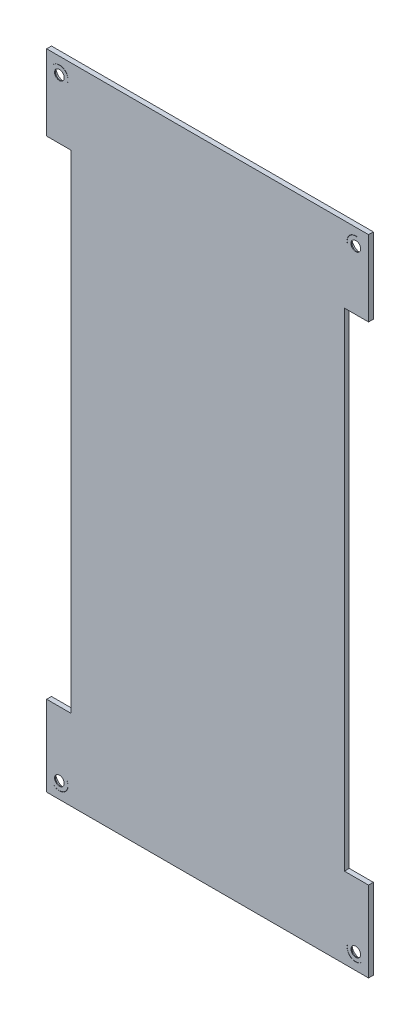
ISO-10303-21;
HEADER;
FILE_DESCRIPTION(('STEP AP214'),'2;1');
FILE_NAME('part.step','',(''),(''),'','','');
FILE_SCHEMA(('AUTOMOTIVE_DESIGN { 1 0 10303 214 1 1 1 1 }'));
ENDSEC;
DATA;
#1=APPLICATION_CONTEXT('core data for automotive mechanical design processes');
#2=APPLICATION_PROTOCOL_DEFINITION('international standard','automotive_design',2000,#1);
#3=PRODUCT_CONTEXT('',#1,'mechanical');
#4=PRODUCT('Part','Part','',(#3));
#5=PRODUCT_RELATED_PRODUCT_CATEGORY('part','',(#4));
#6=PRODUCT_DEFINITION_FORMATION('','',#4);
#7=PRODUCT_DEFINITION_CONTEXT('part definition',#1,'design');
#8=PRODUCT_DEFINITION('design','',#6,#7);
#9=PRODUCT_DEFINITION_SHAPE('','',#8);
#10=(LENGTH_UNIT() NAMED_UNIT(*) SI_UNIT(.MILLI.,.METRE.));
#11=(NAMED_UNIT(*) PLANE_ANGLE_UNIT() SI_UNIT($,.RADIAN.));
#12=(NAMED_UNIT(*) SI_UNIT($,.STERADIAN.) SOLID_ANGLE_UNIT());
#13=UNCERTAINTY_MEASURE_WITH_UNIT(LENGTH_MEASURE(1.E-05),#10,'distance_accuracy_value','');
#14=(GEOMETRIC_REPRESENTATION_CONTEXT(3) GLOBAL_UNCERTAINTY_ASSIGNED_CONTEXT((#13)) GLOBAL_UNIT_ASSIGNED_CONTEXT((#10,
#11,#12)) REPRESENTATION_CONTEXT('',''));
#15=CARTESIAN_POINT('',(0.,0.,0.));
#16=DIRECTION('',(0.,0.,1.));
#17=DIRECTION('',(1.,0.,0.));
#18=AXIS2_PLACEMENT_3D('',#15,#16,#17);
#19=CARTESIAN_POINT('',(0.,200.,1.5));
#20=DIRECTION('',(1.,0.,0.));
#21=DIRECTION('',(0.,1.,0.));
#22=AXIS2_PLACEMENT_3D('',#19,#20,#21);
#23=PLANE('',#22);
#24=DIRECTION('',(0.,0.,-1.));
#25=VECTOR('',#24,1.);
#26=CARTESIAN_POINT('',(0.,176.5,1.5));
#27=LINE('',#26,#25);
#28=CARTESIAN_POINT('',(0.,176.5,1.5));
#29=VERTEX_POINT('',#28);
#30=CARTESIAN_POINT('',(0.,176.5,0.));
#31=VERTEX_POINT('',#30);
#32=EDGE_CURVE('E189',#29,#31,#27,.T.);
#33=ORIENTED_EDGE('',*,*,#32,.F.);
#34=DIRECTION('',(0.,-1.,0.));
#35=VECTOR('',#34,1.);
#36=CARTESIAN_POINT('',(0.,200.,1.5));
#37=LINE('',#36,#35);
#38=CARTESIAN_POINT('',(0.,200.,1.5));
#39=VERTEX_POINT('',#38);
#40=EDGE_CURVE('E358',#39,#29,#37,.T.);
#41=ORIENTED_EDGE('',*,*,#40,.F.);
#42=DIRECTION('',(0.,0.,-1.));
#43=VECTOR('',#42,1.);
#44=CARTESIAN_POINT('',(0.,200.,1.5));
#45=LINE('',#44,#43);
#46=CARTESIAN_POINT('',(0.,200.,0.));
#47=VERTEX_POINT('',#46);
#48=EDGE_CURVE('E216',#39,#47,#45,.T.);
#49=ORIENTED_EDGE('',*,*,#48,.T.);
#50=DIRECTION('',(0.,-1.,0.));
#51=VECTOR('',#50,1.);
#52=CARTESIAN_POINT('',(0.,200.,0.));
#53=LINE('',#52,#51);
#54=EDGE_CURVE('E207',#47,#31,#53,.T.);
#55=ORIENTED_EDGE('',*,*,#54,.T.);
#56=EDGE_LOOP('',(#33,#41,#49,#55));
#57=FACE_BOUND('',#56,.T.);
#58=ADVANCED_FACE('F51',(#57),#23,.F.);
#59=CARTESIAN_POINT('',(100.,200.,1.5));
#60=DIRECTION('',(-1.,0.,0.));
#61=DIRECTION('',(0.,-1.,0.));
#62=AXIS2_PLACEMENT_3D('',#59,#60,#61);
#63=PLANE('',#62);
#64=DIRECTION('',(0.,0.,1.));
#65=VECTOR('',#64,1.);
#66=CARTESIAN_POINT('',(100.,176.5,0.));
#67=LINE('',#66,#65);
#68=CARTESIAN_POINT('',(100.,176.5,0.));
#69=VERTEX_POINT('',#68);
#70=CARTESIAN_POINT('',(100.,176.5,1.5));
#71=VERTEX_POINT('',#70);
#72=EDGE_CURVE('E347',#69,#71,#67,.T.);
#73=ORIENTED_EDGE('',*,*,#72,.F.);
#74=DIRECTION('',(0.,1.,0.));
#75=VECTOR('',#74,1.);
#76=CARTESIAN_POINT('',(100.,200.,0.));
#77=LINE('',#76,#75);
#78=CARTESIAN_POINT('',(100.,200.,0.));
#79=VERTEX_POINT('',#78);
#80=EDGE_CURVE('E224',#69,#79,#77,.T.);
#81=ORIENTED_EDGE('',*,*,#80,.T.);
#82=DIRECTION('',(0.,0.,-1.));
#83=VECTOR('',#82,1.);
#84=CARTESIAN_POINT('',(100.,200.,1.5));
#85=LINE('',#84,#83);
#86=CARTESIAN_POINT('',(100.,200.,1.5));
#87=VERTEX_POINT('',#86);
#88=EDGE_CURVE('E241',#87,#79,#85,.T.);
#89=ORIENTED_EDGE('',*,*,#88,.F.);
#90=DIRECTION('',(0.,1.,0.));
#91=VECTOR('',#90,1.);
#92=CARTESIAN_POINT('',(100.,200.,1.5));
#93=LINE('',#92,#91);
#94=EDGE_CURVE('E310',#71,#87,#93,.T.);
#95=ORIENTED_EDGE('',*,*,#94,.F.);
#96=EDGE_LOOP('',(#73,#81,#89,#95));
#97=FACE_BOUND('',#96,.T.);
#98=ADVANCED_FACE('F480',(#97),#63,.F.);
#99=DIRECTION('',(0.,0.,-1.));
#100=VECTOR('',#99,1.);
#101=CARTESIAN_POINT('',(0.,25.,1.5));
#102=LINE('',#101,#100);
#103=CARTESIAN_POINT('',(0.,25.,1.5));
#104=VERTEX_POINT('',#103);
#105=CARTESIAN_POINT('',(0.,25.,0.));
#106=VERTEX_POINT('',#105);
#107=EDGE_CURVE('E350',#104,#106,#102,.T.);
#108=ORIENTED_EDGE('',*,*,#107,.T.);
#109=CARTESIAN_POINT('',(0.,0.,0.));
#110=VERTEX_POINT('',#109);
#111=EDGE_CURVE('E219',#106,#110,#53,.T.);
#112=ORIENTED_EDGE('',*,*,#111,.T.);
#113=DIRECTION('',(0.,0.,-1.));
#114=VECTOR('',#113,1.);
#115=CARTESIAN_POINT('',(0.,0.,1.5));
#116=LINE('',#115,#114);
#117=CARTESIAN_POINT('',(0.,0.,1.5));
#118=VERTEX_POINT('',#117);
#119=EDGE_CURVE('E249',#118,#110,#116,.T.);
#120=ORIENTED_EDGE('',*,*,#119,.F.);
#121=EDGE_CURVE('E238',#104,#118,#37,.T.);
#122=ORIENTED_EDGE('',*,*,#121,.F.);
#123=EDGE_LOOP('',(#108,#112,#120,#122));
#124=FACE_BOUND('',#123,.T.);
#125=ADVANCED_FACE('F53',(#124),#23,.F.);
#126=CARTESIAN_POINT('',(0.,0.,1.5));
#127=DIRECTION('',(0.,0.,1.));
#128=DIRECTION('',(1.,0.,0.));
#129=AXIS2_PLACEMENT_3D('',#126,#127,#128);
#130=PLANE('',#129);
#131=DIRECTION('',(-1.,0.,0.));
#132=VECTOR('',#131,1.);
#133=CARTESIAN_POINT('',(7.49999999999997,176.5,1.5));
#134=LINE('',#133,#132);
#135=CARTESIAN_POINT('',(7.49999999999997,176.5,1.5));
#136=VERTEX_POINT('',#135);
#137=EDGE_CURVE('E195',#136,#29,#134,.T.);
#138=ORIENTED_EDGE('',*,*,#137,.F.);
#139=DIRECTION('',(0.,1.,0.));
#140=VECTOR('',#139,1.);
#141=CARTESIAN_POINT('',(7.49999999999997,25.,1.5));
#142=LINE('',#141,#140);
#143=CARTESIAN_POINT('',(7.49999999999997,25.,1.5));
#144=VERTEX_POINT('',#143);
#145=EDGE_CURVE('E419',#144,#136,#142,.T.);
#146=ORIENTED_EDGE('',*,*,#145,.F.);
#147=DIRECTION('',(1.,0.,0.));
#148=VECTOR('',#147,1.);
#149=CARTESIAN_POINT('',(0.,25.,1.5));
#150=LINE('',#149,#148);
#151=EDGE_CURVE('E370',#104,#144,#150,.T.);
#152=ORIENTED_EDGE('',*,*,#151,.F.);
#153=ORIENTED_EDGE('',*,*,#121,.T.);
#154=DIRECTION('',(1.,0.,0.));
#155=VECTOR('',#154,1.);
#156=CARTESIAN_POINT('',(0.,0.,1.5));
#157=LINE('',#156,#155);
#158=CARTESIAN_POINT('',(100.,0.,1.5));
#159=VERTEX_POINT('',#158);
#160=EDGE_CURVE('E357',#118,#159,#157,.T.);
#161=ORIENTED_EDGE('',*,*,#160,.T.);
#162=CARTESIAN_POINT('',(100.,25.,1.5));
#163=VERTEX_POINT('',#162);
#164=EDGE_CURVE('E307',#159,#163,#93,.T.);
#165=ORIENTED_EDGE('',*,*,#164,.T.);
#166=DIRECTION('',(-1.,0.,0.));
#167=VECTOR('',#166,1.);
#168=CARTESIAN_POINT('',(100.,25.,1.5));
#169=LINE('',#168,#167);
#170=CARTESIAN_POINT('',(92.5,25.,1.5));
#171=VERTEX_POINT('',#170);
#172=EDGE_CURVE('E354',#163,#171,#169,.T.);
#173=ORIENTED_EDGE('',*,*,#172,.T.);
#174=DIRECTION('',(0.,1.,0.));
#175=VECTOR('',#174,1.);
#176=CARTESIAN_POINT('',(92.5,25.,1.5));
#177=LINE('',#176,#175);
#178=CARTESIAN_POINT('',(92.5,176.5,1.5));
#179=VERTEX_POINT('',#178);
#180=EDGE_CURVE('E366',#171,#179,#177,.T.);
#181=ORIENTED_EDGE('',*,*,#180,.T.);
#182=DIRECTION('',(-1.,0.,0.));
#183=VECTOR('',#182,1.);
#184=CARTESIAN_POINT('',(100.,176.5,1.5));
#185=LINE('',#184,#183);
#186=EDGE_CURVE('E344',#71,#179,#185,.T.);
#187=ORIENTED_EDGE('',*,*,#186,.F.);
#188=ORIENTED_EDGE('',*,*,#94,.T.);
#189=DIRECTION('',(-1.,0.,0.));
#190=VECTOR('',#189,1.);
#191=CARTESIAN_POINT('',(0.,200.,1.5));
#192=LINE('',#191,#190);
#193=EDGE_CURVE('E229',#87,#39,#192,.T.);
#194=ORIENTED_EDGE('',*,*,#193,.T.);
#195=ORIENTED_EDGE('',*,*,#40,.T.);
#196=EDGE_LOOP('',(#138,#146,#152,#153,#161,#165,#173,#181,#187,#188,#194,#195));
#197=FACE_BOUND('',#196,.T.);
#198=CARTESIAN_POINT('',(4.,5.,1.5));
#199=DIRECTION('',(0.,0.,1.));
#200=DIRECTION('',(-1.,0.,0.));
#201=AXIS2_PLACEMENT_3D('',#198,#199,#200);
#202=CIRCLE('',#201,2.66700000000001);
#203=CARTESIAN_POINT('',(1.67893848788693,3.68639334007953,1.5));
#204=VERTEX_POINT('',#203);
#205=CARTESIAN_POINT('',(6.28074734628875,6.38241836735372,1.5));
#206=VERTEX_POINT('',#205);
#207=EDGE_CURVE('E380',#204,#206,#202,.T.);
#208=ORIENTED_EDGE('',*,*,#207,.F.);
#209=CARTESIAN_POINT('',(3.95968583417575,5.06881170743312,1.5));
#210=DIRECTION('',(0.,0.,1.));
#211=DIRECTION('',(-1.,0.,0.));
#212=AXIS2_PLACEMENT_3D('',#209,#210,#211);
#213=CIRCLE('',#212,2.66700000000001);
#214=EDGE_CURVE('E341',#204,#206,#213,.T.);
#215=ORIENTED_EDGE('',*,*,#214,.T.);
#216=EDGE_LOOP('',(#208,#215));
#217=FACE_BOUND('',#216,.T.);
#218=CARTESIAN_POINT('',(96.,195.,1.5));
#219=DIRECTION('',(0.,0.,1.));
#220=DIRECTION('',(-1.,0.,0.));
#221=AXIS2_PLACEMENT_3D('',#218,#219,#220);
#222=CIRCLE('',#221,2.66700000000002);
#223=CARTESIAN_POINT('',(98.3210615121133,196.31360665992,1.5));
#224=VERTEX_POINT('',#223);
#225=CARTESIAN_POINT('',(93.7192526537114,193.617581632646,1.5));
#226=VERTEX_POINT('',#225);
#227=EDGE_CURVE('E379',#224,#226,#222,.T.);
#228=ORIENTED_EDGE('',*,*,#227,.F.);
#229=CARTESIAN_POINT('',(96.0403141658243,194.931188292567,1.5));
#230=DIRECTION('',(0.,0.,1.));
#231=DIRECTION('',(-1.,0.,0.));
#232=AXIS2_PLACEMENT_3D('',#229,#230,#231);
#233=CIRCLE('',#232,2.66700000000001);
#234=EDGE_CURVE('E315',#224,#226,#233,.T.);
#235=ORIENTED_EDGE('',*,*,#234,.T.);
#236=EDGE_LOOP('',(#228,#235));
#237=FACE_BOUND('',#236,.T.);
#238=CARTESIAN_POINT('',(96.,5.,1.5));
#239=DIRECTION('',(0.,0.,1.));
#240=DIRECTION('',(1.,0.,0.));
#241=AXIS2_PLACEMENT_3D('',#238,#239,#240);
#242=CIRCLE('',#241,2.66700000000003);
#243=CARTESIAN_POINT('',(93.7192526537115,6.38241836735407,1.5));
#244=VERTEX_POINT('',#243);
#245=CARTESIAN_POINT('',(98.3210615121133,3.68639334007987,1.5));
#246=VERTEX_POINT('',#245);
#247=EDGE_CURVE('E383',#244,#246,#242,.T.);
#248=ORIENTED_EDGE('',*,*,#247,.F.);
#249=CARTESIAN_POINT('',(96.0403141658243,5.06881170743312,1.5));
#250=DIRECTION('',(0.,0.,1.));
#251=DIRECTION('',(1.,0.,0.));
#252=AXIS2_PLACEMENT_3D('',#249,#250,#251);
#253=CIRCLE('',#252,2.66700000000001);
#254=EDGE_CURVE('E407',#244,#246,#253,.T.);
#255=ORIENTED_EDGE('',*,*,#254,.T.);
#256=EDGE_LOOP('',(#248,#255));
#257=FACE_BOUND('',#256,.T.);
#258=CARTESIAN_POINT('',(4.,195.,1.5));
#259=DIRECTION('',(0.,0.,1.));
#260=DIRECTION('',(1.,0.,0.));
#261=AXIS2_PLACEMENT_3D('',#258,#259,#260);
#262=CIRCLE('',#261,2.66700000000001);
#263=CARTESIAN_POINT('',(6.28074734628876,193.617581632646,1.5));
#264=VERTEX_POINT('',#263);
#265=CARTESIAN_POINT('',(1.67893848788693,196.31360665992,1.5));
#266=VERTEX_POINT('',#265);
#267=EDGE_CURVE('E259',#264,#266,#262,.T.);
#268=ORIENTED_EDGE('',*,*,#267,.F.);
#269=CARTESIAN_POINT('',(3.95968583417575,194.931188292567,1.5));
#270=DIRECTION('',(0.,0.,1.));
#271=DIRECTION('',(1.,0.,0.));
#272=AXIS2_PLACEMENT_3D('',#269,#270,#271);
#273=CIRCLE('',#272,2.66700000000001);
#274=EDGE_CURVE('E329',#264,#266,#273,.T.);
#275=ORIENTED_EDGE('',*,*,#274,.T.);
#276=EDGE_LOOP('',(#268,#275));
#277=FACE_BOUND('',#276,.T.);
#278=CARTESIAN_POINT('',(3.95968583417575,194.931188292567,1.5));
#279=DIRECTION('',(0.,0.,1.));
#280=DIRECTION('',(1.,0.,0.));
#281=AXIS2_PLACEMENT_3D('',#278,#279,#280);
#282=CIRCLE('',#281,1.5);
#283=CARTESIAN_POINT('',(5.45968583417575,194.931188292567,1.5));
#284=VERTEX_POINT('',#283);
#285=EDGE_CURVE('E317',#284,#284,#282,.T.);
#286=ORIENTED_EDGE('',*,*,#285,.F.);
#287=EDGE_LOOP('',(#286));
#288=FACE_BOUND('',#287,.T.);
#289=CARTESIAN_POINT('',(96.0403141658243,5.06881170743312,1.5));
#290=DIRECTION('',(0.,0.,1.));
#291=DIRECTION('',(1.,0.,0.));
#292=AXIS2_PLACEMENT_3D('',#289,#290,#291);
#293=CIRCLE('',#292,1.5);
#294=CARTESIAN_POINT('',(97.5403141658243,5.06881170743312,1.5));
#295=VERTEX_POINT('',#294);
#296=EDGE_CURVE('E320',#295,#295,#293,.T.);
#297=ORIENTED_EDGE('',*,*,#296,.F.);
#298=EDGE_LOOP('',(#297));
#299=FACE_BOUND('',#298,.T.);
#300=CARTESIAN_POINT('',(96.0403141658243,194.931188292567,1.5));
#301=DIRECTION('',(0.,0.,1.));
#302=DIRECTION('',(-1.,0.,0.));
#303=AXIS2_PLACEMENT_3D('',#300,#301,#302);
#304=CIRCLE('',#303,1.5);
#305=CARTESIAN_POINT('',(94.5403141658243,194.931188292567,1.5));
#306=VERTEX_POINT('',#305);
#307=EDGE_CURVE('E314',#306,#306,#304,.T.);
#308=ORIENTED_EDGE('',*,*,#307,.F.);
#309=EDGE_LOOP('',(#308));
#310=FACE_BOUND('',#309,.T.);
#311=CARTESIAN_POINT('',(3.95968583417575,5.06881170743312,1.5));
#312=DIRECTION('',(0.,0.,1.));
#313=DIRECTION('',(-1.,0.,0.));
#314=AXIS2_PLACEMENT_3D('',#311,#312,#313);
#315=CIRCLE('',#314,1.5);
#316=CARTESIAN_POINT('',(2.45968583417575,5.06881170743312,1.5));
#317=VERTEX_POINT('',#316);
#318=EDGE_CURVE('E323',#317,#317,#315,.T.);
#319=ORIENTED_EDGE('',*,*,#318,.F.);
#320=EDGE_LOOP('',(#319));
#321=FACE_BOUND('',#320,.T.);
#322=ADVANCED_FACE('F446',(#197,#217,#237,#257,#277,#288,#299,#310,#321),#130,.T.);
#323=CARTESIAN_POINT('',(0.,0.,0.));
#324=DIRECTION('',(0.,0.,1.));
#325=DIRECTION('',(1.,0.,0.));
#326=AXIS2_PLACEMENT_3D('',#323,#324,#325);
#327=PLANE('',#326);
#328=CARTESIAN_POINT('',(4.,195.,0.));
#329=DIRECTION('',(0.,0.,1.));
#330=DIRECTION('',(1.,0.,0.));
#331=AXIS2_PLACEMENT_3D('',#328,#329,#330);
#332=CIRCLE('',#331,2.66700000000001);
#333=CARTESIAN_POINT('',(6.66700000000001,195.,0.));
#334=VERTEX_POINT('',#333);
#335=EDGE_CURVE('E254',#334,#334,#332,.T.);
#336=ORIENTED_EDGE('',*,*,#335,.T.);
#337=EDGE_LOOP('',(#336));
#338=FACE_BOUND('',#337,.T.);
#339=CARTESIAN_POINT('',(96.,195.,0.));
#340=DIRECTION('',(0.,0.,1.));
#341=DIRECTION('',(1.,0.,0.));
#342=AXIS2_PLACEMENT_3D('',#339,#340,#341);
#343=CIRCLE('',#342,2.66700000000002);
#344=CARTESIAN_POINT('',(98.667,195.,0.));
#345=VERTEX_POINT('',#344);
#346=EDGE_CURVE('E258',#345,#345,#343,.T.);
#347=ORIENTED_EDGE('',*,*,#346,.T.);
#348=EDGE_LOOP('',(#347));
#349=FACE_BOUND('',#348,.T.);
#350=CARTESIAN_POINT('',(96.,5.,0.));
#351=DIRECTION('',(0.,0.,1.));
#352=DIRECTION('',(1.,0.,0.));
#353=AXIS2_PLACEMENT_3D('',#350,#351,#352);
#354=CIRCLE('',#353,2.66700000000003);
#355=CARTESIAN_POINT('',(98.667,5.,0.));
#356=VERTEX_POINT('',#355);
#357=EDGE_CURVE('E263',#356,#356,#354,.T.);
#358=ORIENTED_EDGE('',*,*,#357,.T.);
#359=EDGE_LOOP('',(#358));
#360=FACE_BOUND('',#359,.T.);
#361=CARTESIAN_POINT('',(4.,5.,0.));
#362=DIRECTION('',(0.,0.,1.));
#363=DIRECTION('',(1.,0.,0.));
#364=AXIS2_PLACEMENT_3D('',#361,#362,#363);
#365=CIRCLE('',#364,2.66700000000001);
#366=CARTESIAN_POINT('',(6.66700000000001,5.,0.));
#367=VERTEX_POINT('',#366);
#368=EDGE_CURVE('E227',#367,#367,#365,.T.);
#369=ORIENTED_EDGE('',*,*,#368,.T.);
#370=EDGE_LOOP('',(#369));
#371=FACE_BOUND('',#370,.T.);
#372=DIRECTION('',(0.,1.,0.));
#373=VECTOR('',#372,1.);
#374=CARTESIAN_POINT('',(7.49999999999997,25.,0.));
#375=LINE('',#374,#373);
#376=CARTESIAN_POINT('',(7.49999999999997,25.,0.));
#377=VERTEX_POINT('',#376);
#378=CARTESIAN_POINT('',(7.49999999999997,176.5,0.));
#379=VERTEX_POINT('',#378);
#380=EDGE_CURVE('E209',#377,#379,#375,.T.);
#381=ORIENTED_EDGE('',*,*,#380,.T.);
#382=DIRECTION('',(1.,0.,0.));
#383=VECTOR('',#382,1.);
#384=CARTESIAN_POINT('',(0.,176.5,0.));
#385=LINE('',#384,#383);
#386=EDGE_CURVE('E193',#31,#379,#385,.T.);
#387=ORIENTED_EDGE('',*,*,#386,.F.);
#388=ORIENTED_EDGE('',*,*,#54,.F.);
#389=DIRECTION('',(-1.,0.,0.));
#390=VECTOR('',#389,1.);
#391=CARTESIAN_POINT('',(0.,200.,0.));
#392=LINE('',#391,#390);
#393=EDGE_CURVE('E236',#79,#47,#392,.T.);
#394=ORIENTED_EDGE('',*,*,#393,.F.);
#395=ORIENTED_EDGE('',*,*,#80,.F.);
#396=DIRECTION('',(1.,0.,0.));
#397=VECTOR('',#396,1.);
#398=CARTESIAN_POINT('',(92.5,176.5,0.));
#399=LINE('',#398,#397);
#400=CARTESIAN_POINT('',(92.5,176.5,0.));
#401=VERTEX_POINT('',#400);
#402=EDGE_CURVE('E438',#401,#69,#399,.T.);
#403=ORIENTED_EDGE('',*,*,#402,.F.);
#404=DIRECTION('',(0.,1.,0.));
#405=VECTOR('',#404,1.);
#406=CARTESIAN_POINT('',(92.5,25.,0.));
#407=LINE('',#406,#405);
#408=CARTESIAN_POINT('',(92.5,25.,0.));
#409=VERTEX_POINT('',#408);
#410=EDGE_CURVE('E367',#409,#401,#407,.T.);
#411=ORIENTED_EDGE('',*,*,#410,.F.);
#412=DIRECTION('',(-1.,0.,0.));
#413=VECTOR('',#412,1.);
#414=CARTESIAN_POINT('',(100.,25.,0.));
#415=LINE('',#414,#413);
#416=CARTESIAN_POINT('',(100.,25.,0.));
#417=VERTEX_POINT('',#416);
#418=EDGE_CURVE('E364',#417,#409,#415,.T.);
#419=ORIENTED_EDGE('',*,*,#418,.F.);
#420=CARTESIAN_POINT('',(100.,0.,0.));
#421=VERTEX_POINT('',#420);
#422=EDGE_CURVE('E232',#421,#417,#77,.T.);
#423=ORIENTED_EDGE('',*,*,#422,.F.);
#424=DIRECTION('',(1.,0.,0.));
#425=VECTOR('',#424,1.);
#426=CARTESIAN_POINT('',(0.,0.,0.));
#427=LINE('',#426,#425);
#428=EDGE_CURVE('E218',#110,#421,#427,.T.);
#429=ORIENTED_EDGE('',*,*,#428,.F.);
#430=ORIENTED_EDGE('',*,*,#111,.F.);
#431=DIRECTION('',(1.,0.,0.));
#432=VECTOR('',#431,1.);
#433=CARTESIAN_POINT('',(0.,25.,0.));
#434=LINE('',#433,#432);
#435=EDGE_CURVE('E369',#106,#377,#434,.T.);
#436=ORIENTED_EDGE('',*,*,#435,.T.);
#437=EDGE_LOOP('',(#381,#387,#388,#394,#395,#403,#411,#419,#423,#429,#430,#436));
#438=FACE_BOUND('',#437,.T.);
#439=ADVANCED_FACE('F205',(#338,#349,#360,#371,#438),#327,.F.);
#440=CARTESIAN_POINT('',(0.,0.,1.5));
#441=DIRECTION('',(0.,1.,0.));
#442=DIRECTION('',(-1.,0.,0.));
#443=AXIS2_PLACEMENT_3D('',#440,#441,#442);
#444=PLANE('',#443);
#445=ORIENTED_EDGE('',*,*,#428,.T.);
#446=DIRECTION('',(0.,0.,-1.));
#447=VECTOR('',#446,1.);
#448=CARTESIAN_POINT('',(100.,0.,1.5));
#449=LINE('',#448,#447);
#450=EDGE_CURVE('E245',#159,#421,#449,.T.);
#451=ORIENTED_EDGE('',*,*,#450,.F.);
#452=ORIENTED_EDGE('',*,*,#160,.F.);
#453=ORIENTED_EDGE('',*,*,#119,.T.);
#454=EDGE_LOOP('',(#445,#451,#452,#453));
#455=FACE_BOUND('',#454,.T.);
#456=ADVANCED_FACE('F462',(#455),#444,.F.);
#457=ORIENTED_EDGE('',*,*,#422,.T.);
#458=DIRECTION('',(0.,0.,-1.));
#459=VECTOR('',#458,1.);
#460=CARTESIAN_POINT('',(100.,25.,1.5));
#461=LINE('',#460,#459);
#462=EDGE_CURVE('E67',#163,#417,#461,.T.);
#463=ORIENTED_EDGE('',*,*,#462,.F.);
#464=ORIENTED_EDGE('',*,*,#164,.F.);
#465=ORIENTED_EDGE('',*,*,#450,.T.);
#466=EDGE_LOOP('',(#457,#463,#464,#465));
#467=FACE_BOUND('',#466,.T.);
#468=ADVANCED_FACE('F465',(#467),#63,.F.);
#469=CARTESIAN_POINT('',(0.,200.,1.5));
#470=DIRECTION('',(0.,-1.,0.));
#471=DIRECTION('',(0.,0.,-1.));
#472=AXIS2_PLACEMENT_3D('',#469,#470,#471);
#473=PLANE('',#472);
#474=ORIENTED_EDGE('',*,*,#393,.T.);
#475=ORIENTED_EDGE('',*,*,#48,.F.);
#476=ORIENTED_EDGE('',*,*,#193,.F.);
#477=ORIENTED_EDGE('',*,*,#88,.T.);
#478=EDGE_LOOP('',(#474,#475,#476,#477));
#479=FACE_BOUND('',#478,.T.);
#480=ADVANCED_FACE('F486',(#479),#473,.F.);
#481=CARTESIAN_POINT('',(4.,195.,-0.5));
#482=DIRECTION('',(0.,0.,1.));
#483=DIRECTION('',(1.,0.,0.));
#484=AXIS2_PLACEMENT_3D('',#481,#482,#483);
#485=CYLINDRICAL_SURFACE('',#484,2.66700000000001);
#486=CARTESIAN_POINT('',(4.,195.,1.246));
#487=DIRECTION('',(0.,0.,1.));
#488=DIRECTION('',(1.,0.,0.));
#489=AXIS2_PLACEMENT_3D('',#486,#487,#488);
#490=CIRCLE('',#489,2.66700000000001);
#491=CARTESIAN_POINT('',(6.28074734628876,193.617581632646,1.246));
#492=VERTEX_POINT('',#491);
#493=CARTESIAN_POINT('',(1.67893848788693,196.31360665992,1.246));
#494=VERTEX_POINT('',#493);
#495=EDGE_CURVE('E300',#492,#494,#490,.F.);
#496=ORIENTED_EDGE('',*,*,#495,.F.);
#497=DIRECTION('',(0.,0.,1.));
#498=VECTOR('',#497,1.);
#499=CARTESIAN_POINT('',(6.28074734628876,193.617581632646,1.373));
#500=LINE('',#499,#498);
#501=EDGE_CURVE('E11',#492,#264,#500,.T.);
#502=ORIENTED_EDGE('',*,*,#501,.T.);
#503=ORIENTED_EDGE('',*,*,#267,.T.);
#504=DIRECTION('',(0.,0.,1.));
#505=VECTOR('',#504,1.);
#506=CARTESIAN_POINT('',(1.67893848788693,196.31360665992,1.373));
#507=LINE('',#506,#505);
#508=EDGE_CURVE('E60',#266,#494,#507,.F.);
#509=ORIENTED_EDGE('',*,*,#508,.T.);
#510=EDGE_LOOP('',(#496,#502,#503,#509));
#511=FACE_BOUND('',#510,.T.);
#512=ORIENTED_EDGE('',*,*,#335,.F.);
#513=EDGE_LOOP('',(#512));
#514=FACE_BOUND('',#513,.T.);
#515=ADVANCED_FACE('F488',(#511,#514),#485,.F.);
#516=CARTESIAN_POINT('',(96.,195.,-0.5));
#517=DIRECTION('',(0.,0.,1.));
#518=DIRECTION('',(1.,0.,0.));
#519=AXIS2_PLACEMENT_3D('',#516,#517,#518);
#520=CYLINDRICAL_SURFACE('',#519,2.66700000000002);
#521=CARTESIAN_POINT('',(96.,195.,1.246));
#522=DIRECTION('',(0.,0.,-1.));
#523=DIRECTION('',(-1.,0.,0.));
#524=AXIS2_PLACEMENT_3D('',#521,#522,#523);
#525=CIRCLE('',#524,2.66700000000002);
#526=CARTESIAN_POINT('',(93.7192526537114,193.617581632646,1.246));
#527=VERTEX_POINT('',#526);
#528=CARTESIAN_POINT('',(98.3210615121133,196.31360665992,1.246));
#529=VERTEX_POINT('',#528);
#530=EDGE_CURVE('E290',#527,#529,#525,.F.);
#531=ORIENTED_EDGE('',*,*,#530,.T.);
#532=DIRECTION('',(0.,0.,1.));
#533=VECTOR('',#532,1.);
#534=CARTESIAN_POINT('',(98.3210615121133,196.31360665992,1.373));
#535=LINE('',#534,#533);
#536=EDGE_CURVE('E296',#529,#224,#535,.T.);
#537=ORIENTED_EDGE('',*,*,#536,.T.);
#538=ORIENTED_EDGE('',*,*,#227,.T.);
#539=DIRECTION('',(0.,0.,1.));
#540=VECTOR('',#539,1.);
#541=CARTESIAN_POINT('',(93.7192526537114,193.617581632646,1.373));
#542=LINE('',#541,#540);
#543=EDGE_CURVE('E293',#226,#527,#542,.F.);
#544=ORIENTED_EDGE('',*,*,#543,.T.);
#545=EDGE_LOOP('',(#531,#537,#538,#544));
#546=FACE_BOUND('',#545,.T.);
#547=ORIENTED_EDGE('',*,*,#346,.F.);
#548=EDGE_LOOP('',(#547));
#549=FACE_BOUND('',#548,.T.);
#550=ADVANCED_FACE('F493',(#546,#549),#520,.F.);
#551=CARTESIAN_POINT('',(96.,5.,-0.5));
#552=DIRECTION('',(0.,0.,1.));
#553=DIRECTION('',(1.,0.,0.));
#554=AXIS2_PLACEMENT_3D('',#551,#552,#553);
#555=CYLINDRICAL_SURFACE('',#554,2.66700000000003);
#556=CARTESIAN_POINT('',(96.,5.,1.246));
#557=DIRECTION('',(0.,0.,1.));
#558=DIRECTION('',(1.,0.,0.));
#559=AXIS2_PLACEMENT_3D('',#556,#557,#558);
#560=CIRCLE('',#559,2.66700000000003);
#561=CARTESIAN_POINT('',(93.7192526537115,6.38241836735407,1.246));
#562=VERTEX_POINT('',#561);
#563=CARTESIAN_POINT('',(98.3210615121133,3.68639334007987,1.246));
#564=VERTEX_POINT('',#563);
#565=EDGE_CURVE('E279',#562,#564,#560,.F.);
#566=ORIENTED_EDGE('',*,*,#565,.F.);
#567=DIRECTION('',(0.,0.,1.));
#568=VECTOR('',#567,1.);
#569=CARTESIAN_POINT('',(93.7192526537115,6.38241836735407,1.373));
#570=LINE('',#569,#568);
#571=EDGE_CURVE('E286',#562,#244,#570,.T.);
#572=ORIENTED_EDGE('',*,*,#571,.T.);
#573=ORIENTED_EDGE('',*,*,#247,.T.);
#574=DIRECTION('',(0.,0.,1.));
#575=VECTOR('',#574,1.);
#576=CARTESIAN_POINT('',(98.3210615121133,3.68639334007987,1.373));
#577=LINE('',#576,#575);
#578=EDGE_CURVE('E283',#246,#564,#577,.F.);
#579=ORIENTED_EDGE('',*,*,#578,.T.);
#580=EDGE_LOOP('',(#566,#572,#573,#579));
#581=FACE_BOUND('',#580,.T.);
#582=ORIENTED_EDGE('',*,*,#357,.F.);
#583=EDGE_LOOP('',(#582));
#584=FACE_BOUND('',#583,.T.);
#585=ADVANCED_FACE('F512',(#581,#584),#555,.F.);
#586=CARTESIAN_POINT('',(4.,5.,-0.5));
#587=DIRECTION('',(0.,0.,1.));
#588=DIRECTION('',(1.,0.,0.));
#589=AXIS2_PLACEMENT_3D('',#586,#587,#588);
#590=CYLINDRICAL_SURFACE('',#589,2.66700000000001);
#591=CARTESIAN_POINT('',(4.,5.,1.246));
#592=DIRECTION('',(0.,0.,-1.));
#593=DIRECTION('',(-1.,0.,0.));
#594=AXIS2_PLACEMENT_3D('',#591,#592,#593);
#595=CIRCLE('',#594,2.66700000000001);
#596=CARTESIAN_POINT('',(6.28074734628875,6.38241836735372,1.246));
#597=VERTEX_POINT('',#596);
#598=CARTESIAN_POINT('',(1.67893848788693,3.68639334007953,1.246));
#599=VERTEX_POINT('',#598);
#600=EDGE_CURVE('E253',#597,#599,#595,.F.);
#601=ORIENTED_EDGE('',*,*,#600,.T.);
#602=DIRECTION('',(0.,0.,1.));
#603=VECTOR('',#602,1.);
#604=CARTESIAN_POINT('',(1.67893848788693,3.68639334007953,1.373));
#605=LINE('',#604,#603);
#606=EDGE_CURVE('E275',#599,#204,#605,.T.);
#607=ORIENTED_EDGE('',*,*,#606,.T.);
#608=ORIENTED_EDGE('',*,*,#207,.T.);
#609=DIRECTION('',(0.,0.,1.));
#610=VECTOR('',#609,1.);
#611=CARTESIAN_POINT('',(6.28074734628875,6.38241836735372,1.373));
#612=LINE('',#611,#610);
#613=EDGE_CURVE('E272',#206,#597,#612,.F.);
#614=ORIENTED_EDGE('',*,*,#613,.T.);
#615=EDGE_LOOP('',(#601,#607,#608,#614));
#616=FACE_BOUND('',#615,.T.);
#617=ORIENTED_EDGE('',*,*,#368,.F.);
#618=EDGE_LOOP('',(#617));
#619=FACE_BOUND('',#618,.T.);
#620=ADVANCED_FACE('F508',(#616,#619),#590,.F.);
#621=CARTESIAN_POINT('',(3.95968583417575,5.06881170743312,1.246));
#622=DIRECTION('',(0.,0.,1.));
#623=DIRECTION('',(1.,0.,0.));
#624=AXIS2_PLACEMENT_3D('',#621,#622,#623);
#625=CYLINDRICAL_SURFACE('',#624,2.66700000000001);
#626=ORIENTED_EDGE('',*,*,#606,.F.);
#627=CARTESIAN_POINT('',(3.95968583417575,5.06881170743312,1.246));
#628=DIRECTION('',(0.,0.,1.));
#629=DIRECTION('',(-1.,0.,0.));
#630=AXIS2_PLACEMENT_3D('',#627,#628,#629);
#631=CIRCLE('',#630,2.66700000000001);
#632=EDGE_CURVE('E304',#599,#597,#631,.T.);
#633=ORIENTED_EDGE('',*,*,#632,.T.);
#634=ORIENTED_EDGE('',*,*,#613,.F.);
#635=ORIENTED_EDGE('',*,*,#214,.F.);
#636=EDGE_LOOP('',(#626,#633,#634,#635));
#637=FACE_BOUND('',#636,.T.);
#638=ADVANCED_FACE('F511',(#637),#625,.T.);
#639=CARTESIAN_POINT('',(3.95968583417575,5.06881170743312,1.246));
#640=DIRECTION('',(0.,0.,-1.));
#641=DIRECTION('',(-1.,0.,0.));
#642=AXIS2_PLACEMENT_3D('',#639,#640,#641);
#643=PLANE('',#642);
#644=CARTESIAN_POINT('',(3.95968583417575,5.06881170743312,1.246));
#645=DIRECTION('',(0.,0.,1.));
#646=DIRECTION('',(-1.,0.,0.));
#647=AXIS2_PLACEMENT_3D('',#644,#645,#646);
#648=CIRCLE('',#647,1.5);
#649=CARTESIAN_POINT('',(2.45968583417575,5.06881170743312,1.246));
#650=VERTEX_POINT('',#649);
#651=EDGE_CURVE('E327',#650,#650,#648,.T.);
#652=ORIENTED_EDGE('',*,*,#651,.T.);
#653=EDGE_LOOP('',(#652));
#654=FACE_BOUND('',#653,.T.);
#655=ORIENTED_EDGE('',*,*,#600,.F.);
#656=ORIENTED_EDGE('',*,*,#632,.F.);
#657=EDGE_LOOP('',(#655,#656));
#658=FACE_BOUND('',#657,.T.);
#659=ADVANCED_FACE('F537',(#654,#658),#643,.T.);
#660=CARTESIAN_POINT('',(3.95968583417575,5.06881170743312,1.246));
#661=DIRECTION('',(0.,0.,1.));
#662=DIRECTION('',(1.,0.,0.));
#663=AXIS2_PLACEMENT_3D('',#660,#661,#662);
#664=CYLINDRICAL_SURFACE('',#663,1.5);
#665=ORIENTED_EDGE('',*,*,#651,.F.);
#666=EDGE_LOOP('',(#665));
#667=FACE_BOUND('',#666,.T.);
#668=ORIENTED_EDGE('',*,*,#318,.T.);
#669=EDGE_LOOP('',(#668));
#670=FACE_BOUND('',#669,.T.);
#671=ADVANCED_FACE('F533',(#667,#670),#664,.F.);
#672=CARTESIAN_POINT('',(96.0403141658243,5.06881170743312,1.246));
#673=DIRECTION('',(0.,0.,1.));
#674=DIRECTION('',(1.,0.,0.));
#675=AXIS2_PLACEMENT_3D('',#672,#673,#674);
#676=CYLINDRICAL_SURFACE('',#675,2.66700000000001);
#677=ORIENTED_EDGE('',*,*,#571,.F.);
#678=CARTESIAN_POINT('',(96.0403141658243,5.06881170743312,1.246));
#679=DIRECTION('',(0.,0.,1.));
#680=DIRECTION('',(1.,0.,0.));
#681=AXIS2_PLACEMENT_3D('',#678,#679,#680);
#682=CIRCLE('',#681,2.66700000000001);
#683=EDGE_CURVE('E398',#562,#564,#682,.T.);
#684=ORIENTED_EDGE('',*,*,#683,.T.);
#685=ORIENTED_EDGE('',*,*,#578,.F.);
#686=ORIENTED_EDGE('',*,*,#254,.F.);
#687=EDGE_LOOP('',(#677,#684,#685,#686));
#688=FACE_BOUND('',#687,.T.);
#689=ADVANCED_FACE('F536',(#688),#676,.T.);
#690=CARTESIAN_POINT('',(96.0403141658243,5.06881170743312,1.246));
#691=DIRECTION('',(0.,0.,1.));
#692=DIRECTION('',(1.,0.,0.));
#693=AXIS2_PLACEMENT_3D('',#690,#691,#692);
#694=PLANE('',#693);
#695=CARTESIAN_POINT('',(96.0403141658243,5.06881170743312,1.246));
#696=DIRECTION('',(0.,0.,1.));
#697=DIRECTION('',(1.,0.,0.));
#698=AXIS2_PLACEMENT_3D('',#695,#696,#697);
#699=CIRCLE('',#698,1.5);
#700=CARTESIAN_POINT('',(97.5403141658243,5.06881170743312,1.246));
#701=VERTEX_POINT('',#700);
#702=EDGE_CURVE('E403',#701,#701,#699,.T.);
#703=ORIENTED_EDGE('',*,*,#702,.T.);
#704=EDGE_LOOP('',(#703));
#705=FACE_BOUND('',#704,.T.);
#706=ORIENTED_EDGE('',*,*,#683,.F.);
#707=ORIENTED_EDGE('',*,*,#565,.T.);
#708=EDGE_LOOP('',(#706,#707));
#709=FACE_BOUND('',#708,.T.);
#710=ADVANCED_FACE('F559',(#705,#709),#694,.F.);
#711=CARTESIAN_POINT('',(96.0403141658243,5.06881170743312,1.246));
#712=DIRECTION('',(0.,0.,1.));
#713=DIRECTION('',(1.,0.,0.));
#714=AXIS2_PLACEMENT_3D('',#711,#712,#713);
#715=CYLINDRICAL_SURFACE('',#714,1.5);
#716=ORIENTED_EDGE('',*,*,#702,.F.);
#717=EDGE_LOOP('',(#716));
#718=FACE_BOUND('',#717,.T.);
#719=ORIENTED_EDGE('',*,*,#296,.T.);
#720=EDGE_LOOP('',(#719));
#721=FACE_BOUND('',#720,.T.);
#722=ADVANCED_FACE('F555',(#718,#721),#715,.F.);
#723=CARTESIAN_POINT('',(96.0403141658243,194.931188292567,1.246));
#724=DIRECTION('',(0.,0.,1.));
#725=DIRECTION('',(1.,0.,0.));
#726=AXIS2_PLACEMENT_3D('',#723,#724,#725);
#727=CYLINDRICAL_SURFACE('',#726,2.66700000000001);
#728=ORIENTED_EDGE('',*,*,#536,.F.);
#729=CARTESIAN_POINT('',(96.0403141658243,194.931188292567,1.246));
#730=DIRECTION('',(0.,0.,1.));
#731=DIRECTION('',(-1.,0.,0.));
#732=AXIS2_PLACEMENT_3D('',#729,#730,#731);
#733=CIRCLE('',#732,2.66700000000001);
#734=EDGE_CURVE('E326',#529,#527,#733,.T.);
#735=ORIENTED_EDGE('',*,*,#734,.T.);
#736=ORIENTED_EDGE('',*,*,#543,.F.);
#737=ORIENTED_EDGE('',*,*,#234,.F.);
#738=EDGE_LOOP('',(#728,#735,#736,#737));
#739=FACE_BOUND('',#738,.T.);
#740=ADVANCED_FACE('F551',(#739),#727,.T.);
#741=CARTESIAN_POINT('',(96.0403141658243,194.931188292567,1.246));
#742=DIRECTION('',(0.,0.,-1.));
#743=DIRECTION('',(-1.,0.,0.));
#744=AXIS2_PLACEMENT_3D('',#741,#742,#743);
#745=PLANE('',#744);
#746=CARTESIAN_POINT('',(96.0403141658243,194.931188292567,1.246));
#747=DIRECTION('',(0.,0.,1.));
#748=DIRECTION('',(-1.,0.,0.));
#749=AXIS2_PLACEMENT_3D('',#746,#747,#748);
#750=CIRCLE('',#749,1.5);
#751=CARTESIAN_POINT('',(94.5403141658243,194.931188292567,1.246));
#752=VERTEX_POINT('',#751);
#753=EDGE_CURVE('E311',#752,#752,#750,.T.);
#754=ORIENTED_EDGE('',*,*,#753,.T.);
#755=EDGE_LOOP('',(#754));
#756=FACE_BOUND('',#755,.T.);
#757=ORIENTED_EDGE('',*,*,#530,.F.);
#758=ORIENTED_EDGE('',*,*,#734,.F.);
#759=EDGE_LOOP('',(#757,#758));
#760=FACE_BOUND('',#759,.T.);
#761=ADVANCED_FACE('F547',(#756,#760),#745,.T.);
#762=CARTESIAN_POINT('',(96.0403141658243,194.931188292567,1.246));
#763=DIRECTION('',(0.,0.,1.));
#764=DIRECTION('',(1.,0.,0.));
#765=AXIS2_PLACEMENT_3D('',#762,#763,#764);
#766=CYLINDRICAL_SURFACE('',#765,1.5);
#767=ORIENTED_EDGE('',*,*,#753,.F.);
#768=EDGE_LOOP('',(#767));
#769=FACE_BOUND('',#768,.T.);
#770=ORIENTED_EDGE('',*,*,#307,.T.);
#771=EDGE_LOOP('',(#770));
#772=FACE_BOUND('',#771,.T.);
#773=ADVANCED_FACE('F524',(#769,#772),#766,.F.);
#774=CARTESIAN_POINT('',(3.95968583417575,194.931188292567,1.246));
#775=DIRECTION('',(0.,0.,1.));
#776=DIRECTION('',(1.,0.,0.));
#777=AXIS2_PLACEMENT_3D('',#774,#775,#776);
#778=CYLINDRICAL_SURFACE('',#777,2.66700000000001);
#779=ORIENTED_EDGE('',*,*,#501,.F.);
#780=CARTESIAN_POINT('',(3.95968583417575,194.931188292567,1.246));
#781=DIRECTION('',(0.,0.,1.));
#782=DIRECTION('',(1.,0.,0.));
#783=AXIS2_PLACEMENT_3D('',#780,#781,#782);
#784=CIRCLE('',#783,2.66700000000001);
#785=EDGE_CURVE('E332',#492,#494,#784,.T.);
#786=ORIENTED_EDGE('',*,*,#785,.T.);
#787=ORIENTED_EDGE('',*,*,#508,.F.);
#788=ORIENTED_EDGE('',*,*,#274,.F.);
#789=EDGE_LOOP('',(#779,#786,#787,#788));
#790=FACE_BOUND('',#789,.T.);
#791=ADVANCED_FACE('F520',(#790),#778,.T.);
#792=CARTESIAN_POINT('',(3.95968583417575,194.931188292567,1.246));
#793=DIRECTION('',(0.,0.,1.));
#794=DIRECTION('',(1.,0.,0.));
#795=AXIS2_PLACEMENT_3D('',#792,#793,#794);
#796=PLANE('',#795);
#797=CARTESIAN_POINT('',(3.95968583417575,194.931188292567,1.246));
#798=DIRECTION('',(0.,0.,1.));
#799=DIRECTION('',(1.,0.,0.));
#800=AXIS2_PLACEMENT_3D('',#797,#798,#799);
#801=CIRCLE('',#800,1.5);
#802=CARTESIAN_POINT('',(5.45968583417575,194.931188292567,1.246));
#803=VERTEX_POINT('',#802);
#804=EDGE_CURVE('E319',#803,#803,#801,.T.);
#805=ORIENTED_EDGE('',*,*,#804,.T.);
#806=EDGE_LOOP('',(#805));
#807=FACE_BOUND('',#806,.T.);
#808=ORIENTED_EDGE('',*,*,#785,.F.);
#809=ORIENTED_EDGE('',*,*,#495,.T.);
#810=EDGE_LOOP('',(#808,#809));
#811=FACE_BOUND('',#810,.T.);
#812=ADVANCED_FACE('F523',(#807,#811),#796,.F.);
#813=CARTESIAN_POINT('',(3.95968583417575,194.931188292567,1.246));
#814=DIRECTION('',(0.,0.,1.));
#815=DIRECTION('',(1.,0.,0.));
#816=AXIS2_PLACEMENT_3D('',#813,#814,#815);
#817=CYLINDRICAL_SURFACE('',#816,1.5);
#818=ORIENTED_EDGE('',*,*,#804,.F.);
#819=EDGE_LOOP('',(#818));
#820=FACE_BOUND('',#819,.T.);
#821=ORIENTED_EDGE('',*,*,#285,.T.);
#822=EDGE_LOOP('',(#821));
#823=FACE_BOUND('',#822,.T.);
#824=ADVANCED_FACE('F528',(#820,#823),#817,.F.);
#825=CARTESIAN_POINT('',(0.,25.,1.5));
#826=DIRECTION('',(0.,1.,0.));
#827=DIRECTION('',(0.,0.,1.));
#828=AXIS2_PLACEMENT_3D('',#825,#826,#827);
#829=PLANE('',#828);
#830=ORIENTED_EDGE('',*,*,#435,.F.);
#831=ORIENTED_EDGE('',*,*,#107,.F.);
#832=ORIENTED_EDGE('',*,*,#151,.T.);
#833=DIRECTION('',(0.,0.,-1.));
#834=VECTOR('',#833,1.);
#835=CARTESIAN_POINT('',(7.49999999999997,25.,1.5));
#836=LINE('',#835,#834);
#837=EDGE_CURVE('E335',#144,#377,#836,.T.);
#838=ORIENTED_EDGE('',*,*,#837,.T.);
#839=EDGE_LOOP('',(#830,#831,#832,#838));
#840=FACE_BOUND('',#839,.T.);
#841=ADVANCED_FACE('F453',(#840),#829,.T.);
#842=CARTESIAN_POINT('',(7.49999999999997,25.,1.5));
#843=DIRECTION('',(-1.,0.,0.));
#844=DIRECTION('',(0.,0.,1.));
#845=AXIS2_PLACEMENT_3D('',#842,#843,#844);
#846=PLANE('',#845);
#847=ORIENTED_EDGE('',*,*,#380,.F.);
#848=ORIENTED_EDGE('',*,*,#837,.F.);
#849=ORIENTED_EDGE('',*,*,#145,.T.);
#850=DIRECTION('',(0.,0.,1.));
#851=VECTOR('',#850,1.);
#852=CARTESIAN_POINT('',(7.49999999999997,176.5,0.));
#853=LINE('',#852,#851);
#854=EDGE_CURVE('E212',#379,#136,#853,.T.);
#855=ORIENTED_EDGE('',*,*,#854,.F.);
#856=EDGE_LOOP('',(#847,#848,#849,#855));
#857=FACE_BOUND('',#856,.T.);
#858=ADVANCED_FACE('F451',(#857),#846,.T.);
#859=CARTESIAN_POINT('',(92.5,25.,1.5));
#860=DIRECTION('',(-1.,0.,0.));
#861=DIRECTION('',(0.,0.,1.));
#862=AXIS2_PLACEMENT_3D('',#859,#860,#861);
#863=PLANE('',#862);
#864=ORIENTED_EDGE('',*,*,#410,.T.);
#865=DIRECTION('',(0.,0.,-1.));
#866=VECTOR('',#865,1.);
#867=CARTESIAN_POINT('',(92.5,176.5,1.5));
#868=LINE('',#867,#866);
#869=EDGE_CURVE('E201',#179,#401,#868,.T.);
#870=ORIENTED_EDGE('',*,*,#869,.F.);
#871=ORIENTED_EDGE('',*,*,#180,.F.);
#872=DIRECTION('',(0.,0.,-1.));
#873=VECTOR('',#872,1.);
#874=CARTESIAN_POINT('',(92.5,25.,1.5));
#875=LINE('',#874,#873);
#876=EDGE_CURVE('E353',#171,#409,#875,.T.);
#877=ORIENTED_EDGE('',*,*,#876,.T.);
#878=EDGE_LOOP('',(#864,#870,#871,#877));
#879=FACE_BOUND('',#878,.T.);
#880=ADVANCED_FACE('F472',(#879),#863,.F.);
#881=CARTESIAN_POINT('',(100.,25.,1.5));
#882=DIRECTION('',(0.,-1.,0.));
#883=DIRECTION('',(0.,0.,-1.));
#884=AXIS2_PLACEMENT_3D('',#881,#882,#883);
#885=PLANE('',#884);
#886=ORIENTED_EDGE('',*,*,#418,.T.);
#887=ORIENTED_EDGE('',*,*,#876,.F.);
#888=ORIENTED_EDGE('',*,*,#172,.F.);
#889=ORIENTED_EDGE('',*,*,#462,.T.);
#890=EDGE_LOOP('',(#886,#887,#888,#889));
#891=FACE_BOUND('',#890,.T.);
#892=ADVANCED_FACE('F469',(#891),#885,.F.);
#893=CARTESIAN_POINT('',(0.,176.5,0.));
#894=DIRECTION('',(0.,-1.,0.));
#895=DIRECTION('',(0.,0.,-1.));
#896=AXIS2_PLACEMENT_3D('',#893,#894,#895);
#897=PLANE('',#896);
#898=ORIENTED_EDGE('',*,*,#869,.T.);
#899=ORIENTED_EDGE('',*,*,#402,.T.);
#900=ORIENTED_EDGE('',*,*,#72,.T.);
#901=ORIENTED_EDGE('',*,*,#186,.T.);
#902=EDGE_LOOP('',(#898,#899,#900,#901));
#903=FACE_BOUND('',#902,.T.);
#904=ADVANCED_FACE('F475',(#903),#897,.T.);
#905=CARTESIAN_POINT('',(0.,176.5,0.));
#906=DIRECTION('',(0.,-1.,0.));
#907=DIRECTION('',(0.,0.,-1.));
#908=AXIS2_PLACEMENT_3D('',#905,#906,#907);
#909=PLANE('',#908);
#910=ORIENTED_EDGE('',*,*,#32,.T.);
#911=ORIENTED_EDGE('',*,*,#386,.T.);
#912=ORIENTED_EDGE('',*,*,#854,.T.);
#913=ORIENTED_EDGE('',*,*,#137,.T.);
#914=EDGE_LOOP('',(#910,#911,#912,#913));
#915=FACE_BOUND('',#914,.T.);
#916=ADVANCED_FACE('F191',(#915),#909,.T.);
#917=CLOSED_SHELL('',(#58,#98,#125,#322,#439,#456,#468,#480,#515,#550,#585,#620,#638,#659,#671,
#689,#710,#722,#740,#761,#773,#791,#812,#824,#841,#858,#880,#892,#904,#916));
#918=MANIFOLD_SOLID_BREP('B2',#917);
#919=ADVANCED_BREP_SHAPE_REPRESENTATION('',(#18,#918),#14);
#920=SHAPE_DEFINITION_REPRESENTATION(#9,#919);
ENDSEC;
END-ISO-10303-21;
